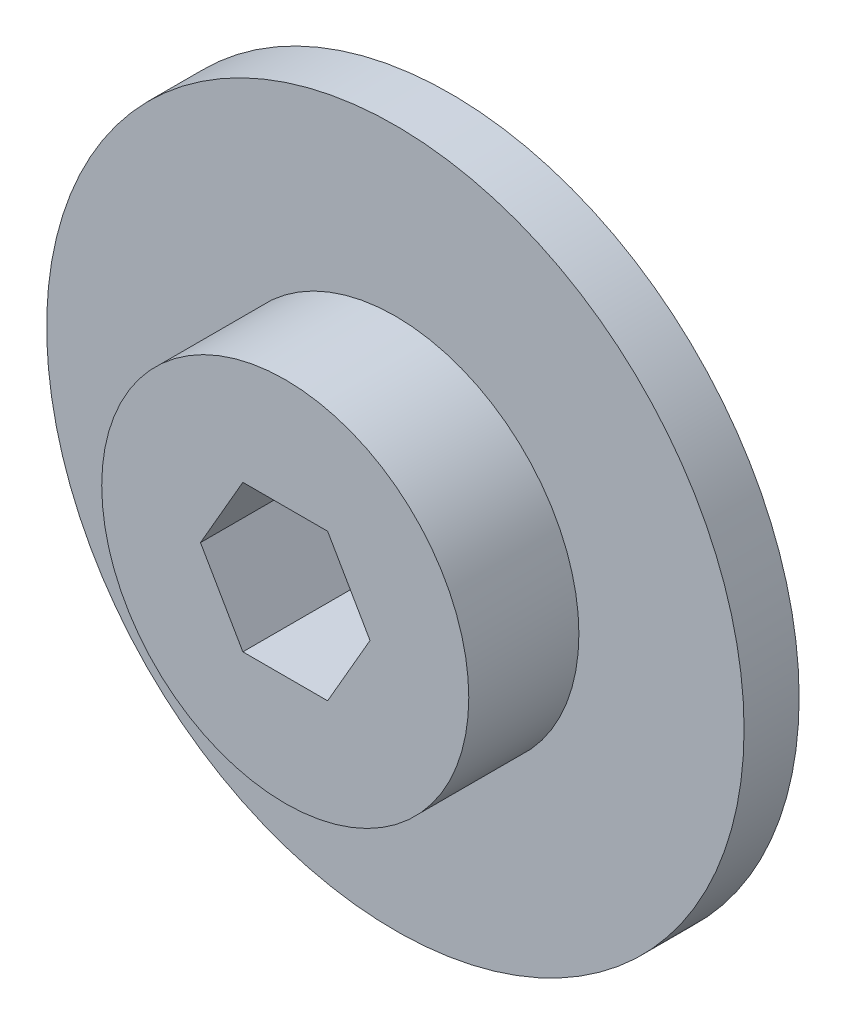
ISO-10303-21;
HEADER;
FILE_DESCRIPTION(('STEP AP214'),'2;1');
FILE_NAME('part.step','',(''),(''),'','','');
FILE_SCHEMA(('AUTOMOTIVE_DESIGN { 1 0 10303 214 1 1 1 1 }'));
ENDSEC;
DATA;
#1=APPLICATION_CONTEXT('core data for automotive mechanical design processes');
#2=APPLICATION_PROTOCOL_DEFINITION('international standard','automotive_design',2000,#1);
#3=PRODUCT_CONTEXT('',#1,'mechanical');
#4=PRODUCT('Part','Part','',(#3));
#5=PRODUCT_RELATED_PRODUCT_CATEGORY('part','',(#4));
#6=PRODUCT_DEFINITION_FORMATION('','',#4);
#7=PRODUCT_DEFINITION_CONTEXT('part definition',#1,'design');
#8=PRODUCT_DEFINITION('design','',#6,#7);
#9=PRODUCT_DEFINITION_SHAPE('','',#8);
#10=(LENGTH_UNIT() NAMED_UNIT(*) SI_UNIT(.MILLI.,.METRE.));
#11=(NAMED_UNIT(*) PLANE_ANGLE_UNIT() SI_UNIT($,.RADIAN.));
#12=(NAMED_UNIT(*) SI_UNIT($,.STERADIAN.) SOLID_ANGLE_UNIT());
#13=UNCERTAINTY_MEASURE_WITH_UNIT(LENGTH_MEASURE(1.E-05),#10,'distance_accuracy_value','');
#14=(GEOMETRIC_REPRESENTATION_CONTEXT(3) GLOBAL_UNCERTAINTY_ASSIGNED_CONTEXT((#13)) GLOBAL_UNIT_ASSIGNED_CONTEXT((#10,
#11,#12)) REPRESENTATION_CONTEXT('',''));
#15=CARTESIAN_POINT('',(0.,0.,0.));
#16=DIRECTION('',(0.,0.,1.));
#17=DIRECTION('',(1.,0.,0.));
#18=AXIS2_PLACEMENT_3D('',#15,#16,#17);
#19=CARTESIAN_POINT('',(0.,0.,1.5));
#20=DIRECTION('',(0.,0.,-1.));
#21=DIRECTION('',(-1.,0.,0.));
#22=AXIS2_PLACEMENT_3D('',#19,#20,#21);
#23=CYLINDRICAL_SURFACE('',#22,9.5);
#24=CARTESIAN_POINT('',(0.,0.,1.5));
#25=DIRECTION('',(0.,0.,1.));
#26=DIRECTION('',(1.,0.,0.));
#27=AXIS2_PLACEMENT_3D('',#24,#25,#26);
#28=CIRCLE('',#27,9.5);
#29=CARTESIAN_POINT('',(9.5,0.,1.5));
#30=VERTEX_POINT('',#29);
#31=EDGE_CURVE('E46',#30,#30,#28,.T.);
#32=ORIENTED_EDGE('',*,*,#31,.F.);
#33=EDGE_LOOP('',(#32));
#34=FACE_BOUND('',#33,.T.);
#35=CARTESIAN_POINT('',(0.,0.,0.));
#36=DIRECTION('',(0.,0.,1.));
#37=DIRECTION('',(1.,0.,0.));
#38=AXIS2_PLACEMENT_3D('',#35,#36,#37);
#39=CIRCLE('',#38,9.5);
#40=CARTESIAN_POINT('',(9.5,0.,0.));
#41=VERTEX_POINT('',#40);
#42=EDGE_CURVE('E41',#41,#41,#39,.T.);
#43=ORIENTED_EDGE('',*,*,#42,.T.);
#44=EDGE_LOOP('',(#43));
#45=FACE_BOUND('',#44,.T.);
#46=ADVANCED_FACE('F38',(#34,#45),#23,.T.);
#47=CARTESIAN_POINT('',(0.,0.,1.5));
#48=DIRECTION('',(0.,0.,1.));
#49=DIRECTION('',(1.,0.,0.));
#50=AXIS2_PLACEMENT_3D('',#47,#48,#49);
#51=PLANE('',#50);
#52=CARTESIAN_POINT('',(0.,0.,1.5));
#53=DIRECTION('',(0.,0.,1.));
#54=DIRECTION('',(1.,0.,0.));
#55=AXIS2_PLACEMENT_3D('',#52,#53,#54);
#56=CIRCLE('',#55,5.);
#57=CARTESIAN_POINT('',(5.,0.,1.5));
#58=VERTEX_POINT('',#57);
#59=EDGE_CURVE('E11',#58,#58,#56,.T.);
#60=ORIENTED_EDGE('',*,*,#59,.F.);
#61=EDGE_LOOP('',(#60));
#62=FACE_BOUND('',#61,.T.);
#63=ORIENTED_EDGE('',*,*,#31,.T.);
#64=EDGE_LOOP('',(#63));
#65=FACE_BOUND('',#64,.T.);
#66=ADVANCED_FACE('F158',(#62,#65),#51,.T.);
#67=CARTESIAN_POINT('',(0.,0.,0.));
#68=DIRECTION('',(0.,0.,1.));
#69=DIRECTION('',(1.,0.,0.));
#70=AXIS2_PLACEMENT_3D('',#67,#68,#69);
#71=PLANE('',#70);
#72=ORIENTED_EDGE('',*,*,#42,.F.);
#73=EDGE_LOOP('',(#72));
#74=FACE_BOUND('',#73,.T.);
#75=ADVANCED_FACE('F155',(#74),#71,.F.);
#76=CARTESIAN_POINT('',(0.,0.,4.5));
#77=DIRECTION('',(0.,0.,-1.));
#78=DIRECTION('',(-1.,0.,0.));
#79=AXIS2_PLACEMENT_3D('',#76,#77,#78);
#80=CYLINDRICAL_SURFACE('',#79,5.);
#81=CARTESIAN_POINT('',(0.,0.,4.5));
#82=DIRECTION('',(0.,0.,1.));
#83=DIRECTION('',(1.,0.,0.));
#84=AXIS2_PLACEMENT_3D('',#81,#82,#83);
#85=CIRCLE('',#84,5.);
#86=CARTESIAN_POINT('',(5.,0.,4.5));
#87=VERTEX_POINT('',#86);
#88=EDGE_CURVE('E141',#87,#87,#85,.T.);
#89=ORIENTED_EDGE('',*,*,#88,.F.);
#90=EDGE_LOOP('',(#89));
#91=FACE_BOUND('',#90,.T.);
#92=ORIENTED_EDGE('',*,*,#59,.T.);
#93=EDGE_LOOP('',(#92));
#94=FACE_BOUND('',#93,.T.);
#95=ADVANCED_FACE('F157',(#91,#94),#80,.T.);
#96=CARTESIAN_POINT('',(0.,0.,4.5));
#97=DIRECTION('',(0.,0.,1.));
#98=DIRECTION('',(1.,0.,0.));
#99=AXIS2_PLACEMENT_3D('',#96,#97,#98);
#100=PLANE('',#99);
#101=DIRECTION('',(-0.5,0.866025403784439,0.));
#102=VECTOR('',#101,1.);
#103=CARTESIAN_POINT('',(2.3094010767585,0.,4.5));
#104=LINE('',#103,#102);
#105=CARTESIAN_POINT('',(2.3094010767585,0.,4.5));
#106=VERTEX_POINT('',#105);
#107=CARTESIAN_POINT('',(1.15470053837925,2.,4.5));
#108=VERTEX_POINT('',#107);
#109=EDGE_CURVE('E54',#106,#108,#104,.T.);
#110=ORIENTED_EDGE('',*,*,#109,.F.);
#111=DIRECTION('',(0.5,0.866025403784438,0.));
#112=VECTOR('',#111,1.);
#113=CARTESIAN_POINT('',(1.15470053837925,-2.,4.5));
#114=LINE('',#113,#112);
#115=CARTESIAN_POINT('',(1.15470053837925,-2.,4.5));
#116=VERTEX_POINT('',#115);
#117=EDGE_CURVE('E137',#116,#106,#114,.T.);
#118=ORIENTED_EDGE('',*,*,#117,.F.);
#119=DIRECTION('',(1.,0.,0.));
#120=VECTOR('',#119,1.);
#121=CARTESIAN_POINT('',(-1.15470053837925,-2.,4.5));
#122=LINE('',#121,#120);
#123=CARTESIAN_POINT('',(-1.15470053837925,-2.,4.5));
#124=VERTEX_POINT('',#123);
#125=EDGE_CURVE('E135',#124,#116,#122,.T.);
#126=ORIENTED_EDGE('',*,*,#125,.F.);
#127=DIRECTION('',(0.5,-0.866025403784439,0.));
#128=VECTOR('',#127,1.);
#129=CARTESIAN_POINT('',(-2.3094010767585,0.,4.5));
#130=LINE('',#129,#128);
#131=CARTESIAN_POINT('',(-2.3094010767585,0.,4.5));
#132=VERTEX_POINT('',#131);
#133=EDGE_CURVE('E102',#132,#124,#130,.T.);
#134=ORIENTED_EDGE('',*,*,#133,.F.);
#135=DIRECTION('',(-0.5,-0.866025403784438,0.));
#136=VECTOR('',#135,1.);
#137=CARTESIAN_POINT('',(-1.15470053837925,2.,4.5));
#138=LINE('',#137,#136);
#139=CARTESIAN_POINT('',(-1.15470053837925,2.,4.5));
#140=VERTEX_POINT('',#139);
#141=EDGE_CURVE('E131',#140,#132,#138,.T.);
#142=ORIENTED_EDGE('',*,*,#141,.F.);
#143=DIRECTION('',(-1.,0.,0.));
#144=VECTOR('',#143,1.);
#145=CARTESIAN_POINT('',(1.15470053837925,2.,4.5));
#146=LINE('',#145,#144);
#147=EDGE_CURVE('E128',#108,#140,#146,.T.);
#148=ORIENTED_EDGE('',*,*,#147,.F.);
#149=EDGE_LOOP('',(#110,#118,#126,#134,#142,#148));
#150=FACE_BOUND('',#149,.T.);
#151=ORIENTED_EDGE('',*,*,#88,.T.);
#152=EDGE_LOOP('',(#151));
#153=FACE_BOUND('',#152,.T.);
#154=ADVANCED_FACE('F163',(#150,#153),#100,.T.);
#155=CARTESIAN_POINT('',(2.3094010767585,0.,1.5));
#156=DIRECTION('',(0.866025403784438,0.5,0.));
#157=DIRECTION('',(-0.5,0.866025403784439,0.));
#158=AXIS2_PLACEMENT_3D('',#155,#156,#157);
#159=PLANE('',#158);
#160=ORIENTED_EDGE('',*,*,#109,.T.);
#161=DIRECTION('',(0.,0.,1.));
#162=VECTOR('',#161,1.);
#163=CARTESIAN_POINT('',(1.15470053837925,2.,1.5));
#164=LINE('',#163,#162);
#165=CARTESIAN_POINT('',(1.15470053837925,2.,1.5));
#166=VERTEX_POINT('',#165);
#167=EDGE_CURVE('E84',#166,#108,#164,.T.);
#168=ORIENTED_EDGE('',*,*,#167,.F.);
#169=DIRECTION('',(-0.5,0.866025403784439,0.));
#170=VECTOR('',#169,1.);
#171=CARTESIAN_POINT('',(2.3094010767585,0.,1.5));
#172=LINE('',#171,#170);
#173=CARTESIAN_POINT('',(2.3094010767585,0.,1.5));
#174=VERTEX_POINT('',#173);
#175=EDGE_CURVE('E139',#174,#166,#172,.T.);
#176=ORIENTED_EDGE('',*,*,#175,.F.);
#177=DIRECTION('',(0.,0.,1.));
#178=VECTOR('',#177,1.);
#179=CARTESIAN_POINT('',(2.3094010767585,0.,1.5));
#180=LINE('',#179,#178);
#181=EDGE_CURVE('E62',#174,#106,#180,.T.);
#182=ORIENTED_EDGE('',*,*,#181,.T.);
#183=EDGE_LOOP('',(#160,#168,#176,#182));
#184=FACE_BOUND('',#183,.T.);
#185=ADVANCED_FACE('F195',(#184),#159,.F.);
#186=CARTESIAN_POINT('',(1.15470053837925,-2.,1.5));
#187=DIRECTION('',(0.866025403784439,-0.5,0.));
#188=DIRECTION('',(0.5,0.866025403784439,0.));
#189=AXIS2_PLACEMENT_3D('',#186,#187,#188);
#190=PLANE('',#189);
#191=ORIENTED_EDGE('',*,*,#117,.T.);
#192=ORIENTED_EDGE('',*,*,#181,.F.);
#193=DIRECTION('',(0.5,0.866025403784438,0.));
#194=VECTOR('',#193,1.);
#195=CARTESIAN_POINT('',(1.15470053837925,-2.,1.5));
#196=LINE('',#195,#194);
#197=CARTESIAN_POINT('',(1.15470053837925,-2.,1.5));
#198=VERTEX_POINT('',#197);
#199=EDGE_CURVE('E114',#198,#174,#196,.T.);
#200=ORIENTED_EDGE('',*,*,#199,.F.);
#201=DIRECTION('',(0.,0.,1.));
#202=VECTOR('',#201,1.);
#203=CARTESIAN_POINT('',(1.15470053837925,-2.,1.5));
#204=LINE('',#203,#202);
#205=EDGE_CURVE('E106',#198,#116,#204,.T.);
#206=ORIENTED_EDGE('',*,*,#205,.T.);
#207=EDGE_LOOP('',(#191,#192,#200,#206));
#208=FACE_BOUND('',#207,.T.);
#209=ADVANCED_FACE('F206',(#208),#190,.F.);
#210=CARTESIAN_POINT('',(-1.15470053837925,-2.,1.5));
#211=DIRECTION('',(0.,-1.,0.));
#212=DIRECTION('',(1.,0.,0.));
#213=AXIS2_PLACEMENT_3D('',#210,#211,#212);
#214=PLANE('',#213);
#215=ORIENTED_EDGE('',*,*,#125,.T.);
#216=ORIENTED_EDGE('',*,*,#205,.F.);
#217=DIRECTION('',(1.,0.,0.));
#218=VECTOR('',#217,1.);
#219=CARTESIAN_POINT('',(-1.15470053837925,-2.,1.5));
#220=LINE('',#219,#218);
#221=CARTESIAN_POINT('',(-1.15470053837925,-2.,1.5));
#222=VERTEX_POINT('',#221);
#223=EDGE_CURVE('E110',#222,#198,#220,.T.);
#224=ORIENTED_EDGE('',*,*,#223,.F.);
#225=DIRECTION('',(0.,0.,1.));
#226=VECTOR('',#225,1.);
#227=CARTESIAN_POINT('',(-1.15470053837925,-2.,1.5));
#228=LINE('',#227,#226);
#229=EDGE_CURVE('E95',#222,#124,#228,.T.);
#230=ORIENTED_EDGE('',*,*,#229,.T.);
#231=EDGE_LOOP('',(#215,#216,#224,#230));
#232=FACE_BOUND('',#231,.T.);
#233=ADVANCED_FACE('F111',(#232),#214,.F.);
#234=CARTESIAN_POINT('',(-2.3094010767585,0.,1.5));
#235=DIRECTION('',(-0.866025403784439,-0.5,0.));
#236=DIRECTION('',(0.5,-0.866025403784439,0.));
#237=AXIS2_PLACEMENT_3D('',#234,#235,#236);
#238=PLANE('',#237);
#239=ORIENTED_EDGE('',*,*,#133,.T.);
#240=ORIENTED_EDGE('',*,*,#229,.F.);
#241=DIRECTION('',(0.5,-0.866025403784439,0.));
#242=VECTOR('',#241,1.);
#243=CARTESIAN_POINT('',(-2.3094010767585,0.,1.5));
#244=LINE('',#243,#242);
#245=CARTESIAN_POINT('',(-2.3094010767585,0.,1.5));
#246=VERTEX_POINT('',#245);
#247=EDGE_CURVE('E99',#246,#222,#244,.T.);
#248=ORIENTED_EDGE('',*,*,#247,.F.);
#249=DIRECTION('',(0.,0.,1.));
#250=VECTOR('',#249,1.);
#251=CARTESIAN_POINT('',(-2.3094010767585,0.,1.5));
#252=LINE('',#251,#250);
#253=EDGE_CURVE('E107',#246,#132,#252,.T.);
#254=ORIENTED_EDGE('',*,*,#253,.T.);
#255=EDGE_LOOP('',(#239,#240,#248,#254));
#256=FACE_BOUND('',#255,.T.);
#257=ADVANCED_FACE('F97',(#256),#238,.F.);
#258=CARTESIAN_POINT('',(-1.15470053837925,2.,1.5));
#259=DIRECTION('',(-0.866025403784439,0.5,0.));
#260=DIRECTION('',(-0.5,-0.866025403784439,0.));
#261=AXIS2_PLACEMENT_3D('',#258,#259,#260);
#262=PLANE('',#261);
#263=ORIENTED_EDGE('',*,*,#141,.T.);
#264=ORIENTED_EDGE('',*,*,#253,.F.);
#265=DIRECTION('',(-0.5,-0.866025403784438,0.));
#266=VECTOR('',#265,1.);
#267=CARTESIAN_POINT('',(-1.15470053837925,2.,1.5));
#268=LINE('',#267,#266);
#269=CARTESIAN_POINT('',(-1.15470053837925,2.,1.5));
#270=VERTEX_POINT('',#269);
#271=EDGE_CURVE('E120',#270,#246,#268,.T.);
#272=ORIENTED_EDGE('',*,*,#271,.F.);
#273=DIRECTION('',(0.,0.,1.));
#274=VECTOR('',#273,1.);
#275=CARTESIAN_POINT('',(-1.15470053837925,2.,1.5));
#276=LINE('',#275,#274);
#277=EDGE_CURVE('E144',#270,#140,#276,.T.);
#278=ORIENTED_EDGE('',*,*,#277,.T.);
#279=EDGE_LOOP('',(#263,#264,#272,#278));
#280=FACE_BOUND('',#279,.T.);
#281=ADVANCED_FACE('F234',(#280),#262,.F.);
#282=CARTESIAN_POINT('',(1.15470053837925,2.,1.5));
#283=DIRECTION('',(0.,1.,0.));
#284=DIRECTION('',(-1.,0.,0.));
#285=AXIS2_PLACEMENT_3D('',#282,#283,#284);
#286=PLANE('',#285);
#287=ORIENTED_EDGE('',*,*,#147,.T.);
#288=ORIENTED_EDGE('',*,*,#277,.F.);
#289=DIRECTION('',(-1.,0.,0.));
#290=VECTOR('',#289,1.);
#291=CARTESIAN_POINT('',(1.15470053837925,2.,1.5));
#292=LINE('',#291,#290);
#293=EDGE_CURVE('E122',#166,#270,#292,.T.);
#294=ORIENTED_EDGE('',*,*,#293,.F.);
#295=ORIENTED_EDGE('',*,*,#167,.T.);
#296=EDGE_LOOP('',(#287,#288,#294,#295));
#297=FACE_BOUND('',#296,.T.);
#298=ADVANCED_FACE('F244',(#297),#286,.F.);
#299=CARTESIAN_POINT('',(0.,0.,1.5));
#300=DIRECTION('',(0.,0.,1.));
#301=DIRECTION('',(1.,0.,0.));
#302=AXIS2_PLACEMENT_3D('',#299,#300,#301);
#303=PLANE('',#302);
#304=ORIENTED_EDGE('',*,*,#175,.T.);
#305=ORIENTED_EDGE('',*,*,#293,.T.);
#306=ORIENTED_EDGE('',*,*,#271,.T.);
#307=ORIENTED_EDGE('',*,*,#247,.T.);
#308=ORIENTED_EDGE('',*,*,#223,.T.);
#309=ORIENTED_EDGE('',*,*,#199,.T.);
#310=EDGE_LOOP('',(#304,#305,#306,#307,#308,#309));
#311=FACE_BOUND('',#310,.T.);
#312=ADVANCED_FACE('F117',(#311),#303,.T.);
#313=CLOSED_SHELL('',(#46,#66,#75,#95,#154,#185,#209,#233,#257,#281,#298,#312));
#314=MANIFOLD_SOLID_BREP('B2',#313);
#315=ADVANCED_BREP_SHAPE_REPRESENTATION('',(#18,#314),#14);
#316=SHAPE_DEFINITION_REPRESENTATION(#9,#315);
ENDSEC;
END-ISO-10303-21;
